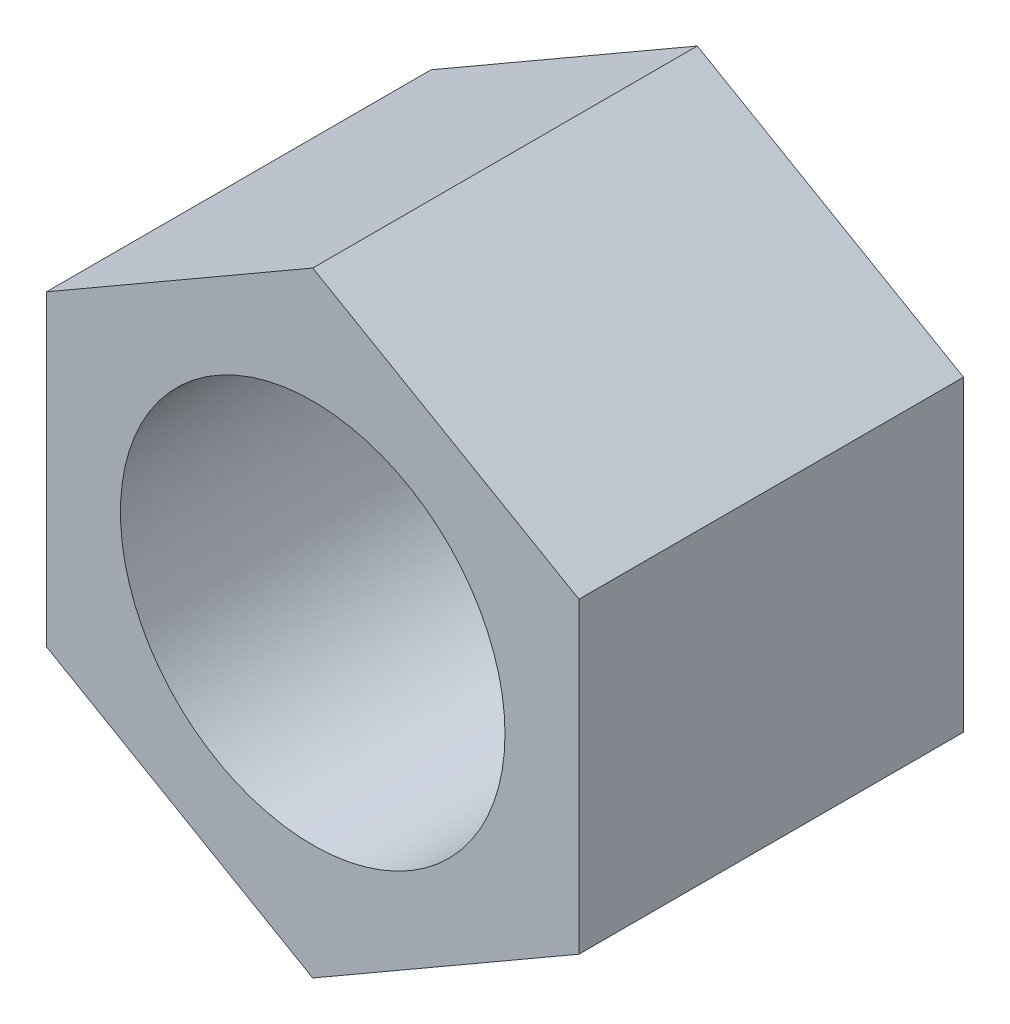
ISO-10303-21;
HEADER;
FILE_DESCRIPTION(('STEP AP214'),'2;1');
FILE_NAME('part.step','',(''),(''),'','','');
FILE_SCHEMA(('AUTOMOTIVE_DESIGN { 1 0 10303 214 1 1 1 1 }'));
ENDSEC;
DATA;
#1=APPLICATION_CONTEXT('core data for automotive mechanical design processes');
#2=APPLICATION_PROTOCOL_DEFINITION('international standard','automotive_design',2000,#1);
#3=PRODUCT_CONTEXT('',#1,'mechanical');
#4=PRODUCT('Part','Part','',(#3));
#5=PRODUCT_RELATED_PRODUCT_CATEGORY('part','',(#4));
#6=PRODUCT_DEFINITION_FORMATION('','',#4);
#7=PRODUCT_DEFINITION_CONTEXT('part definition',#1,'design');
#8=PRODUCT_DEFINITION('design','',#6,#7);
#9=PRODUCT_DEFINITION_SHAPE('','',#8);
#10=(LENGTH_UNIT() NAMED_UNIT(*) SI_UNIT(.MILLI.,.METRE.));
#11=(NAMED_UNIT(*) PLANE_ANGLE_UNIT() SI_UNIT($,.RADIAN.));
#12=(NAMED_UNIT(*) SI_UNIT($,.STERADIAN.) SOLID_ANGLE_UNIT());
#13=UNCERTAINTY_MEASURE_WITH_UNIT(LENGTH_MEASURE(1.E-05),#10,'distance_accuracy_value','');
#14=(GEOMETRIC_REPRESENTATION_CONTEXT(3) GLOBAL_UNCERTAINTY_ASSIGNED_CONTEXT((#13)) GLOBAL_UNIT_ASSIGNED_CONTEXT((#10,
#11,#12)) REPRESENTATION_CONTEXT('',''));
#15=CARTESIAN_POINT('',(0.,0.,0.));
#16=DIRECTION('',(0.,0.,1.));
#17=DIRECTION('',(1.,0.,0.));
#18=AXIS2_PLACEMENT_3D('',#15,#16,#17);
#19=CARTESIAN_POINT('',(0.,0.,3.));
#20=DIRECTION('',(0.,0.,1.));
#21=DIRECTION('',(1.,0.,0.));
#22=AXIS2_PLACEMENT_3D('',#19,#20,#21);
#23=PLANE('',#22);
#24=DIRECTION('',(0.866025403784443,-0.499999999999993,0.));
#25=VECTOR('',#24,1.);
#26=CARTESIAN_POINT('',(-74.744869058924,83.9377883011967,3.));
#27=LINE('',#26,#25);
#28=CARTESIAN_POINT('',(-74.744869058924,83.9377883011967,3.));
#29=VERTEX_POINT('',#28);
#30=CARTESIAN_POINT('',(-72.6679313544105,82.7386677584058,3.));
#31=VERTEX_POINT('',#30);
#32=EDGE_CURVE('E128',#29,#31,#27,.T.);
#33=ORIENTED_EDGE('',*,*,#32,.T.);
#34=DIRECTION('',(0.866025403784439,0.499999999999999,0.));
#35=VECTOR('',#34,1.);
#36=CARTESIAN_POINT('',(-72.6679313544105,82.7386677584058,3.));
#37=LINE('',#36,#35);
#38=CARTESIAN_POINT('',(-70.590993649897,83.9377883011967,3.));
#39=VERTEX_POINT('',#38);
#40=EDGE_CURVE('E86',#31,#39,#37,.T.);
#41=ORIENTED_EDGE('',*,*,#40,.T.);
#42=DIRECTION('',(0.,1.,0.));
#43=VECTOR('',#42,1.);
#44=CARTESIAN_POINT('',(-70.590993649897,83.9377883011967,3.));
#45=LINE('',#44,#43);
#46=CARTESIAN_POINT('',(-70.590993649897,86.3360293867787,3.));
#47=VERTEX_POINT('',#46);
#48=EDGE_CURVE('E99',#39,#47,#45,.T.);
#49=ORIENTED_EDGE('',*,*,#48,.T.);
#50=DIRECTION('',(-0.866025403784441,0.499999999999995,0.));
#51=VECTOR('',#50,1.);
#52=CARTESIAN_POINT('',(-70.590993649897,86.3360293867787,3.));
#53=LINE('',#52,#51);
#54=CARTESIAN_POINT('',(-72.6679313544105,87.5351499295697,3.));
#55=VERTEX_POINT('',#54);
#56=EDGE_CURVE('E93',#47,#55,#53,.T.);
#57=ORIENTED_EDGE('',*,*,#56,.T.);
#58=DIRECTION('',(-0.866025403784435,-0.500000000000006,0.));
#59=VECTOR('',#58,1.);
#60=CARTESIAN_POINT('',(-72.6679313544105,87.5351499295697,3.));
#61=LINE('',#60,#59);
#62=CARTESIAN_POINT('',(-74.7448690589241,86.3360293867787,3.));
#63=VERTEX_POINT('',#62);
#64=EDGE_CURVE('E97',#55,#63,#61,.T.);
#65=ORIENTED_EDGE('',*,*,#64,.T.);
#66=DIRECTION('',(0.,-1.,0.));
#67=VECTOR('',#66,1.);
#68=CARTESIAN_POINT('',(-74.7448690589241,86.3360293867787,3.));
#69=LINE('',#68,#67);
#70=EDGE_CURVE('E49',#63,#29,#69,.T.);
#71=ORIENTED_EDGE('',*,*,#70,.T.);
#72=EDGE_LOOP('',(#33,#41,#49,#57,#65,#71));
#73=FACE_BOUND('',#72,.T.);
#74=CARTESIAN_POINT('',(-72.6679313544105,85.1369088439877,3.));
#75=DIRECTION('',(0.,0.,1.));
#76=DIRECTION('',(1.,0.,0.));
#77=AXIS2_PLACEMENT_3D('',#74,#75,#76);
#78=CIRCLE('',#77,1.5);
#79=CARTESIAN_POINT('',(-71.1679313544105,85.1369088439877,3.));
#80=VERTEX_POINT('',#79);
#81=EDGE_CURVE('E121',#80,#80,#78,.T.);
#82=ORIENTED_EDGE('',*,*,#81,.F.);
#83=EDGE_LOOP('',(#82));
#84=FACE_BOUND('',#83,.T.);
#85=ADVANCED_FACE('F32',(#73,#84),#23,.T.);
#86=CARTESIAN_POINT('',(0.,0.,0.));
#87=DIRECTION('',(0.,0.,1.));
#88=DIRECTION('',(1.,0.,0.));
#89=AXIS2_PLACEMENT_3D('',#86,#87,#88);
#90=PLANE('',#89);
#91=DIRECTION('',(0.866025403784443,-0.499999999999993,0.));
#92=VECTOR('',#91,1.);
#93=CARTESIAN_POINT('',(-74.744869058924,83.9377883011967,0.));
#94=LINE('',#93,#92);
#95=CARTESIAN_POINT('',(-74.744869058924,83.9377883011967,0.));
#96=VERTEX_POINT('',#95);
#97=CARTESIAN_POINT('',(-72.6679313544105,82.7386677584058,0.));
#98=VERTEX_POINT('',#97);
#99=EDGE_CURVE('E117',#96,#98,#94,.T.);
#100=ORIENTED_EDGE('',*,*,#99,.F.);
#101=DIRECTION('',(0.,-1.,0.));
#102=VECTOR('',#101,1.);
#103=CARTESIAN_POINT('',(-74.7448690589241,86.3360293867787,0.));
#104=LINE('',#103,#102);
#105=CARTESIAN_POINT('',(-74.7448690589241,86.3360293867787,0.));
#106=VERTEX_POINT('',#105);
#107=EDGE_CURVE('E78',#106,#96,#104,.T.);
#108=ORIENTED_EDGE('',*,*,#107,.F.);
#109=DIRECTION('',(-0.866025403784435,-0.500000000000006,0.));
#110=VECTOR('',#109,1.);
#111=CARTESIAN_POINT('',(-72.6679313544105,87.5351499295697,0.));
#112=LINE('',#111,#110);
#113=CARTESIAN_POINT('',(-72.6679313544105,87.5351499295697,0.));
#114=VERTEX_POINT('',#113);
#115=EDGE_CURVE('E72',#114,#106,#112,.T.);
#116=ORIENTED_EDGE('',*,*,#115,.F.);
#117=DIRECTION('',(-0.866025403784441,0.499999999999995,0.));
#118=VECTOR('',#117,1.);
#119=CARTESIAN_POINT('',(-70.590993649897,86.3360293867787,0.));
#120=LINE('',#119,#118);
#121=CARTESIAN_POINT('',(-70.590993649897,86.3360293867787,0.));
#122=VERTEX_POINT('',#121);
#123=EDGE_CURVE('E107',#122,#114,#120,.T.);
#124=ORIENTED_EDGE('',*,*,#123,.F.);
#125=DIRECTION('',(0.,1.,0.));
#126=VECTOR('',#125,1.);
#127=CARTESIAN_POINT('',(-70.590993649897,83.9377883011967,0.));
#128=LINE('',#127,#126);
#129=CARTESIAN_POINT('',(-70.590993649897,83.9377883011967,0.));
#130=VERTEX_POINT('',#129);
#131=EDGE_CURVE('E123',#130,#122,#128,.T.);
#132=ORIENTED_EDGE('',*,*,#131,.F.);
#133=DIRECTION('',(0.866025403784439,0.499999999999999,0.));
#134=VECTOR('',#133,1.);
#135=CARTESIAN_POINT('',(-72.6679313544105,82.7386677584058,0.));
#136=LINE('',#135,#134);
#137=EDGE_CURVE('E120',#98,#130,#136,.T.);
#138=ORIENTED_EDGE('',*,*,#137,.F.);
#139=EDGE_LOOP('',(#100,#108,#116,#124,#132,#138));
#140=FACE_BOUND('',#139,.T.);
#141=CARTESIAN_POINT('',(-72.6679313544105,85.1369088439877,0.));
#142=DIRECTION('',(0.,0.,1.));
#143=DIRECTION('',(1.,0.,0.));
#144=AXIS2_PLACEMENT_3D('',#141,#142,#143);
#145=CIRCLE('',#144,1.5);
#146=CARTESIAN_POINT('',(-71.1679313544105,85.1369088439877,0.));
#147=VERTEX_POINT('',#146);
#148=EDGE_CURVE('E221',#147,#147,#145,.T.);
#149=ORIENTED_EDGE('',*,*,#148,.T.);
#150=EDGE_LOOP('',(#149));
#151=FACE_BOUND('',#150,.T.);
#152=ADVANCED_FACE('F137',(#140,#151),#90,.F.);
#153=CARTESIAN_POINT('',(-74.744869058924,83.9377883011967,3.));
#154=DIRECTION('',(0.499999999999993,0.866025403784442,0.));
#155=DIRECTION('',(-0.866025403784443,0.499999999999993,0.));
#156=AXIS2_PLACEMENT_3D('',#153,#154,#155);
#157=PLANE('',#156);
#158=ORIENTED_EDGE('',*,*,#99,.T.);
#159=DIRECTION('',(0.,0.,-1.));
#160=VECTOR('',#159,1.);
#161=CARTESIAN_POINT('',(-72.6679313544105,82.7386677584058,3.));
#162=LINE('',#161,#160);
#163=EDGE_CURVE('E11',#31,#98,#162,.T.);
#164=ORIENTED_EDGE('',*,*,#163,.F.);
#165=ORIENTED_EDGE('',*,*,#32,.F.);
#166=DIRECTION('',(0.,0.,-1.));
#167=VECTOR('',#166,1.);
#168=CARTESIAN_POINT('',(-74.744869058924,83.9377883011967,3.));
#169=LINE('',#168,#167);
#170=EDGE_CURVE('E113',#29,#96,#169,.T.);
#171=ORIENTED_EDGE('',*,*,#170,.T.);
#172=EDGE_LOOP('',(#158,#164,#165,#171));
#173=FACE_BOUND('',#172,.T.);
#174=ADVANCED_FACE('F34',(#173),#157,.F.);
#175=CARTESIAN_POINT('',(-72.6679313544105,82.7386677584058,3.));
#176=DIRECTION('',(-0.499999999999999,0.866025403784439,0.));
#177=DIRECTION('',(-0.866025403784439,-0.499999999999999,0.));
#178=AXIS2_PLACEMENT_3D('',#175,#176,#177);
#179=PLANE('',#178);
#180=ORIENTED_EDGE('',*,*,#137,.T.);
#181=DIRECTION('',(0.,0.,-1.));
#182=VECTOR('',#181,1.);
#183=CARTESIAN_POINT('',(-70.590993649897,83.9377883011967,3.));
#184=LINE('',#183,#182);
#185=EDGE_CURVE('E41',#39,#130,#184,.T.);
#186=ORIENTED_EDGE('',*,*,#185,.F.);
#187=ORIENTED_EDGE('',*,*,#40,.F.);
#188=ORIENTED_EDGE('',*,*,#163,.T.);
#189=EDGE_LOOP('',(#180,#186,#187,#188));
#190=FACE_BOUND('',#189,.T.);
#191=ADVANCED_FACE('F162',(#190),#179,.F.);
#192=CARTESIAN_POINT('',(-70.590993649897,83.9377883011967,3.));
#193=DIRECTION('',(-1.,0.,0.));
#194=DIRECTION('',(0.,-1.,0.));
#195=AXIS2_PLACEMENT_3D('',#192,#193,#194);
#196=PLANE('',#195);
#197=ORIENTED_EDGE('',*,*,#131,.T.);
#198=DIRECTION('',(0.,0.,-1.));
#199=VECTOR('',#198,1.);
#200=CARTESIAN_POINT('',(-70.590993649897,86.3360293867787,3.));
#201=LINE('',#200,#199);
#202=EDGE_CURVE('E108',#47,#122,#201,.T.);
#203=ORIENTED_EDGE('',*,*,#202,.F.);
#204=ORIENTED_EDGE('',*,*,#48,.F.);
#205=ORIENTED_EDGE('',*,*,#185,.T.);
#206=EDGE_LOOP('',(#197,#203,#204,#205));
#207=FACE_BOUND('',#206,.T.);
#208=ADVANCED_FACE('F134',(#207),#196,.F.);
#209=CARTESIAN_POINT('',(-70.590993649897,86.3360293867787,3.));
#210=DIRECTION('',(-0.499999999999995,-0.866025403784442,0.));
#211=DIRECTION('',(0.866025403784442,-0.499999999999995,0.));
#212=AXIS2_PLACEMENT_3D('',#209,#210,#211);
#213=PLANE('',#212);
#214=ORIENTED_EDGE('',*,*,#123,.T.);
#215=DIRECTION('',(0.,0.,-1.));
#216=VECTOR('',#215,1.);
#217=CARTESIAN_POINT('',(-72.6679313544105,87.5351499295697,3.));
#218=LINE('',#217,#216);
#219=EDGE_CURVE('E104',#55,#114,#218,.T.);
#220=ORIENTED_EDGE('',*,*,#219,.F.);
#221=ORIENTED_EDGE('',*,*,#56,.F.);
#222=ORIENTED_EDGE('',*,*,#202,.T.);
#223=EDGE_LOOP('',(#214,#220,#221,#222));
#224=FACE_BOUND('',#223,.T.);
#225=ADVANCED_FACE('F105',(#224),#213,.F.);
#226=CARTESIAN_POINT('',(-72.6679313544105,87.5351499295697,3.));
#227=DIRECTION('',(0.500000000000006,-0.866025403784435,0.));
#228=DIRECTION('',(0.866025403784435,0.500000000000006,0.));
#229=AXIS2_PLACEMENT_3D('',#226,#227,#228);
#230=PLANE('',#229);
#231=ORIENTED_EDGE('',*,*,#115,.T.);
#232=DIRECTION('',(0.,0.,-1.));
#233=VECTOR('',#232,1.);
#234=CARTESIAN_POINT('',(-74.7448690589241,86.3360293867787,3.));
#235=LINE('',#234,#233);
#236=EDGE_CURVE('E109',#63,#106,#235,.T.);
#237=ORIENTED_EDGE('',*,*,#236,.F.);
#238=ORIENTED_EDGE('',*,*,#64,.F.);
#239=ORIENTED_EDGE('',*,*,#219,.T.);
#240=EDGE_LOOP('',(#231,#237,#238,#239));
#241=FACE_BOUND('',#240,.T.);
#242=ADVANCED_FACE('F111',(#241),#230,.F.);
#243=CARTESIAN_POINT('',(-74.7448690589241,86.3360293867787,3.));
#244=DIRECTION('',(1.,0.,0.));
#245=DIRECTION('',(0.,1.,0.));
#246=AXIS2_PLACEMENT_3D('',#243,#244,#245);
#247=PLANE('',#246);
#248=ORIENTED_EDGE('',*,*,#107,.T.);
#249=ORIENTED_EDGE('',*,*,#170,.F.);
#250=ORIENTED_EDGE('',*,*,#70,.F.);
#251=ORIENTED_EDGE('',*,*,#236,.T.);
#252=EDGE_LOOP('',(#248,#249,#250,#251));
#253=FACE_BOUND('',#252,.T.);
#254=ADVANCED_FACE('F142',(#253),#247,.F.);
#255=CARTESIAN_POINT('',(-72.6679313544105,85.1369088439877,3.));
#256=DIRECTION('',(0.,0.,-1.));
#257=DIRECTION('',(-1.,0.,0.));
#258=AXIS2_PLACEMENT_3D('',#255,#256,#257);
#259=CYLINDRICAL_SURFACE('',#258,1.5);
#260=ORIENTED_EDGE('',*,*,#81,.T.);
#261=EDGE_LOOP('',(#260));
#262=FACE_BOUND('',#261,.T.);
#263=ORIENTED_EDGE('',*,*,#148,.F.);
#264=EDGE_LOOP('',(#263));
#265=FACE_BOUND('',#264,.T.);
#266=ADVANCED_FACE('F144',(#262,#265),#259,.F.);
#267=CLOSED_SHELL('',(#85,#152,#174,#191,#208,#225,#242,#254,#266));
#268=MANIFOLD_SOLID_BREP('B2',#267);
#269=ADVANCED_BREP_SHAPE_REPRESENTATION('',(#18,#268),#14);
#270=SHAPE_DEFINITION_REPRESENTATION(#9,#269);
ENDSEC;
END-ISO-10303-21;
